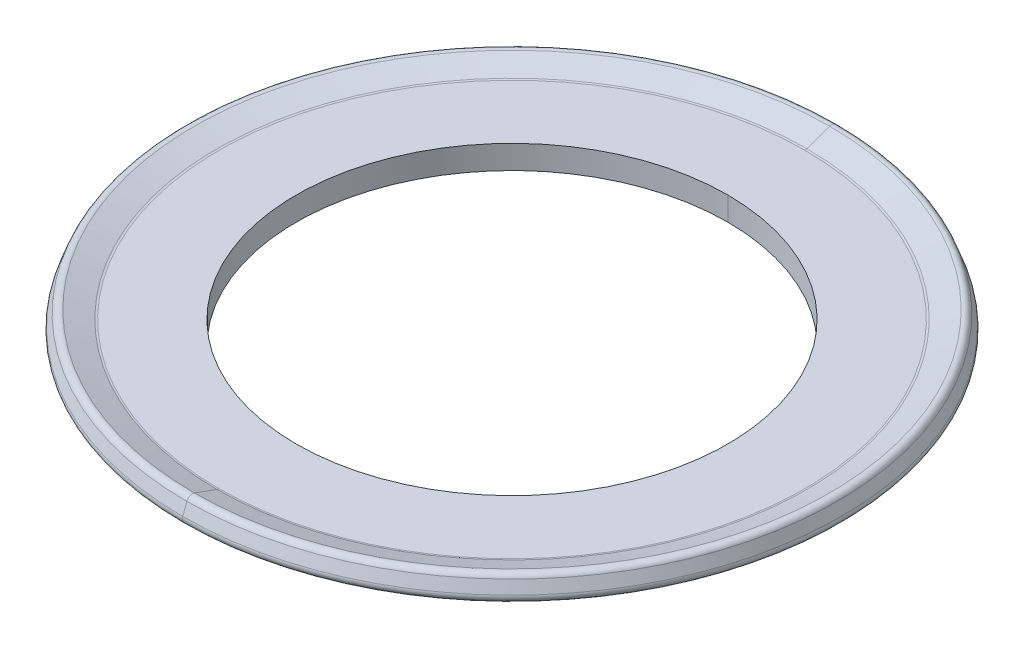
ISO-10303-21;
HEADER;
FILE_DESCRIPTION(('STEP AP214'),'2;1');
FILE_NAME('part.step','',(''),(''),'','','');
FILE_SCHEMA(('AUTOMOTIVE_DESIGN { 1 0 10303 214 1 1 1 1 }'));
ENDSEC;
DATA;
#1=APPLICATION_CONTEXT('core data for automotive mechanical design processes');
#2=APPLICATION_PROTOCOL_DEFINITION('international standard','automotive_design',2000,#1);
#3=PRODUCT_CONTEXT('',#1,'mechanical');
#4=PRODUCT('Part','Part','',(#3));
#5=PRODUCT_RELATED_PRODUCT_CATEGORY('part','',(#4));
#6=PRODUCT_DEFINITION_FORMATION('','',#4);
#7=PRODUCT_DEFINITION_CONTEXT('part definition',#1,'design');
#8=PRODUCT_DEFINITION('design','',#6,#7);
#9=PRODUCT_DEFINITION_SHAPE('','',#8);
#10=(LENGTH_UNIT() NAMED_UNIT(*) SI_UNIT(.MILLI.,.METRE.));
#11=(NAMED_UNIT(*) PLANE_ANGLE_UNIT() SI_UNIT($,.RADIAN.));
#12=(NAMED_UNIT(*) SI_UNIT($,.STERADIAN.) SOLID_ANGLE_UNIT());
#13=UNCERTAINTY_MEASURE_WITH_UNIT(LENGTH_MEASURE(1.E-05),#10,'distance_accuracy_value','');
#14=(GEOMETRIC_REPRESENTATION_CONTEXT(3) GLOBAL_UNCERTAINTY_ASSIGNED_CONTEXT((#13)) GLOBAL_UNIT_ASSIGNED_CONTEXT((#10,
#11,#12)) REPRESENTATION_CONTEXT('',''));
#15=CARTESIAN_POINT('',(0.,0.,0.));
#16=DIRECTION('',(0.,0.,1.));
#17=DIRECTION('',(1.,0.,0.));
#18=AXIS2_PLACEMENT_3D('',#15,#16,#17);
#19=CARTESIAN_POINT('',(0.,0.5,0.));
#20=DIRECTION('',(0.,-1.,0.));
#21=DIRECTION('',(0.,0.,-1.));
#22=AXIS2_PLACEMENT_3D('',#19,#20,#21);
#23=TOROIDAL_SURFACE('',#22,12.5718365096458,0.5);
#24=CARTESIAN_POINT('',(0.,0.5,12.5718365096458));
#25=DIRECTION('',(1.,0.,0.));
#26=DIRECTION('',(0.,0.,-1.));
#27=AXIS2_PLACEMENT_3D('',#24,#25,#26);
#28=CIRCLE('',#27,0.5);
#29=CARTESIAN_POINT('',(0.,0.0301536896070431,12.7428465813086));
#30=VERTEX_POINT('',#29);
#31=CARTESIAN_POINT('',(0.,0.,12.5718365096458));
#32=VERTEX_POINT('',#31);
#33=EDGE_CURVE('E194',#30,#32,#28,.T.);
#34=ORIENTED_EDGE('',*,*,#33,.F.);
#35=CARTESIAN_POINT('',(0.,0.0301536896070431,0.));
#36=DIRECTION('',(0.,1.,0.));
#37=DIRECTION('',(0.,0.,1.));
#38=AXIS2_PLACEMENT_3D('',#35,#36,#37);
#39=CIRCLE('',#38,12.7428465813086);
#40=CARTESIAN_POINT('',(0.,0.0301536896070431,-12.7428465813086));
#41=VERTEX_POINT('',#40);
#42=EDGE_CURVE('E154',#41,#30,#39,.T.);
#43=ORIENTED_EDGE('',*,*,#42,.F.);
#44=CARTESIAN_POINT('',(0.,0.5,-12.5718365096458));
#45=DIRECTION('',(-1.,0.,0.));
#46=DIRECTION('',(0.,0.,1.));
#47=AXIS2_PLACEMENT_3D('',#44,#45,#46);
#48=CIRCLE('',#47,0.5);
#49=CARTESIAN_POINT('',(0.,0.,-12.5718365096458));
#50=VERTEX_POINT('',#49);
#51=EDGE_CURVE('E193',#41,#50,#48,.T.);
#52=ORIENTED_EDGE('',*,*,#51,.T.);
#53=CARTESIAN_POINT('',(0.,0.,0.));
#54=DIRECTION('',(0.,-1.,0.));
#55=DIRECTION('',(0.,0.,-1.));
#56=AXIS2_PLACEMENT_3D('',#53,#54,#55);
#57=CIRCLE('',#56,12.5718365096458);
#58=EDGE_CURVE('E27',#32,#50,#57,.T.);
#59=ORIENTED_EDGE('',*,*,#58,.F.);
#60=EDGE_LOOP('',(#34,#43,#52,#59));
#61=FACE_BOUND('',#60,.T.);
#62=ADVANCED_FACE('F16',(#61),#23,.T.);
#63=CARTESIAN_POINT('',(0.,1.12957180897211,0.));
#64=DIRECTION('',(0.,1.,0.));
#65=DIRECTION('',(0.,0.,1.));
#66=AXIS2_PLACEMENT_3D('',#63,#64,#65);
#67=TOROIDAL_SURFACE('',#66,13.5706197386811,0.25);
#68=CARTESIAN_POINT('',(0.,1.12957180897211,-13.5706197386811));
#69=DIRECTION('',(1.,0.,0.));
#70=DIRECTION('',(0.,0.,-1.));
#71=AXIS2_PLACEMENT_3D('',#68,#69,#70);
#72=CIRCLE('',#71,0.25);
#73=CARTESIAN_POINT('',(0.,1.21507684480352,-13.8055428938775));
#74=VERTEX_POINT('',#73);
#75=CARTESIAN_POINT('',(0.,1.36449496416858,-13.4851147028496));
#76=VERTEX_POINT('',#75);
#77=EDGE_CURVE('E232',#74,#76,#72,.T.);
#78=ORIENTED_EDGE('',*,*,#77,.F.);
#79=CARTESIAN_POINT('',(0.,1.21507684480352,0.));
#80=DIRECTION('',(0.,-1.,0.));
#81=DIRECTION('',(0.,0.,1.));
#82=AXIS2_PLACEMENT_3D('',#79,#80,#81);
#83=CIRCLE('',#82,13.8055428938775);
#84=CARTESIAN_POINT('',(0.,1.21507684480352,13.8055428938775));
#85=VERTEX_POINT('',#84);
#86=EDGE_CURVE('E218',#85,#74,#83,.T.);
#87=ORIENTED_EDGE('',*,*,#86,.F.);
#88=CARTESIAN_POINT('',(0.,1.12957180897211,13.5706197386811));
#89=DIRECTION('',(-1.,0.,0.));
#90=DIRECTION('',(0.,0.,1.));
#91=AXIS2_PLACEMENT_3D('',#88,#89,#90);
#92=CIRCLE('',#91,0.25);
#93=CARTESIAN_POINT('',(0.,1.36449496416858,13.4851147028496));
#94=VERTEX_POINT('',#93);
#95=EDGE_CURVE('E178',#85,#94,#92,.T.);
#96=ORIENTED_EDGE('',*,*,#95,.T.);
#97=CARTESIAN_POINT('',(0.,1.36449496416858,0.));
#98=DIRECTION('',(0.,1.,0.));
#99=DIRECTION('',(0.,0.,-1.));
#100=AXIS2_PLACEMENT_3D('',#97,#98,#99);
#101=CIRCLE('',#100,13.4851147028496);
#102=EDGE_CURVE('E244',#76,#94,#101,.T.);
#103=ORIENTED_EDGE('',*,*,#102,.F.);
#104=EDGE_LOOP('',(#78,#87,#96,#103));
#105=FACE_BOUND('',#104,.T.);
#106=ADVANCED_FACE('F280',(#105),#67,.T.);
#107=CARTESIAN_POINT('',(0.,0.659725498579151,0.));
#108=DIRECTION('',(0.,1.,0.));
#109=DIRECTION('',(0.,0.,1.));
#110=AXIS2_PLACEMENT_3D('',#107,#108,#109);
#111=TOROIDAL_SURFACE('',#110,13.7416298103439,0.25);
#112=CARTESIAN_POINT('',(0.,0.659725498579151,-13.7416298103439));
#113=DIRECTION('',(1.,0.,0.));
#114=DIRECTION('',(0.,0.,-1.));
#115=AXIS2_PLACEMENT_3D('',#112,#113,#114);
#116=CIRCLE('',#115,0.25);
#117=CARTESIAN_POINT('',(0.,0.424802343382673,-13.8271348461753));
#118=VERTEX_POINT('',#117);
#119=CARTESIAN_POINT('',(0.,0.745230534410571,-13.9765529655404));
#120=VERTEX_POINT('',#119);
#121=EDGE_CURVE('E168',#118,#120,#116,.T.);
#122=ORIENTED_EDGE('',*,*,#121,.F.);
#123=CARTESIAN_POINT('',(0.,0.424802343382673,0.));
#124=DIRECTION('',(0.,-1.,0.));
#125=DIRECTION('',(0.,0.,-1.));
#126=AXIS2_PLACEMENT_3D('',#123,#124,#125);
#127=CIRCLE('',#126,13.8271348461753);
#128=CARTESIAN_POINT('',(0.,0.424802343382673,13.8271348461753));
#129=VERTEX_POINT('',#128);
#130=EDGE_CURVE('E145',#129,#118,#127,.T.);
#131=ORIENTED_EDGE('',*,*,#130,.F.);
#132=CARTESIAN_POINT('',(0.,0.659725498579151,13.7416298103439));
#133=DIRECTION('',(-1.,0.,0.));
#134=DIRECTION('',(0.,0.,1.));
#135=AXIS2_PLACEMENT_3D('',#132,#133,#134);
#136=CIRCLE('',#135,0.25);
#137=CARTESIAN_POINT('',(0.,0.745230534410571,13.9765529655404));
#138=VERTEX_POINT('',#137);
#139=EDGE_CURVE('E176',#129,#138,#136,.T.);
#140=ORIENTED_EDGE('',*,*,#139,.T.);
#141=CARTESIAN_POINT('',(0.,0.745230534410571,0.));
#142=DIRECTION('',(0.,1.,0.));
#143=DIRECTION('',(0.,0.,1.));
#144=AXIS2_PLACEMENT_3D('',#141,#142,#143);
#145=CIRCLE('',#144,13.9765529655404);
#146=EDGE_CURVE('E70',#120,#138,#145,.T.);
#147=ORIENTED_EDGE('',*,*,#146,.F.);
#148=EDGE_LOOP('',(#122,#131,#140,#147));
#149=FACE_BOUND('',#148,.T.);
#150=ADVANCED_FACE('F169',(#149),#111,.T.);
#151=CARTESIAN_POINT('',(0.,1.25,0.));
#152=DIRECTION('',(0.,-1.,0.));
#153=DIRECTION('',(0.,0.,-1.));
#154=AXIS2_PLACEMENT_3D('',#151,#152,#153);
#155=TOROIDAL_SURFACE('',#154,12.4395912741144,0.25);
#156=CARTESIAN_POINT('',(0.,1.25,12.4395912741144));
#157=DIRECTION('',(1.,0.,0.));
#158=DIRECTION('',(0.,0.,-1.));
#159=AXIS2_PLACEMENT_3D('',#156,#157,#158);
#160=CIRCLE('',#159,0.25);
#161=CARTESIAN_POINT('',(0.,1.01507684480352,12.5250963099458));
#162=VERTEX_POINT('',#161);
#163=CARTESIAN_POINT('',(0.,1.,12.4395912741144));
#164=VERTEX_POINT('',#163);
#165=EDGE_CURVE('E205',#162,#164,#160,.T.);
#166=ORIENTED_EDGE('',*,*,#165,.F.);
#167=CARTESIAN_POINT('',(0.,1.01507684480352,0.));
#168=DIRECTION('',(0.,-1.,0.));
#169=DIRECTION('',(0.,0.,1.));
#170=AXIS2_PLACEMENT_3D('',#167,#168,#169);
#171=CIRCLE('',#170,12.5250963099458);
#172=CARTESIAN_POINT('',(0.,1.01507684480352,-12.5250963099458));
#173=VERTEX_POINT('',#172);
#174=EDGE_CURVE('E115',#173,#162,#171,.T.);
#175=ORIENTED_EDGE('',*,*,#174,.F.);
#176=CARTESIAN_POINT('',(0.,1.25,-12.4395912741144));
#177=DIRECTION('',(-1.,0.,0.));
#178=DIRECTION('',(0.,0.,1.));
#179=AXIS2_PLACEMENT_3D('',#176,#177,#178);
#180=CIRCLE('',#179,0.25);
#181=CARTESIAN_POINT('',(0.,1.,-12.4395912741144));
#182=VERTEX_POINT('',#181);
#183=EDGE_CURVE('E204',#173,#182,#180,.T.);
#184=ORIENTED_EDGE('',*,*,#183,.T.);
#185=CARTESIAN_POINT('',(0.,1.,0.));
#186=DIRECTION('',(0.,1.,0.));
#187=DIRECTION('',(0.,0.,-1.));
#188=AXIS2_PLACEMENT_3D('',#185,#186,#187);
#189=CIRCLE('',#188,12.4395912741144);
#190=EDGE_CURVE('E20',#164,#182,#189,.T.);
#191=ORIENTED_EDGE('',*,*,#190,.F.);
#192=EDGE_LOOP('',(#166,#175,#184,#191));
#193=FACE_BOUND('',#192,.T.);
#194=ADVANCED_FACE('F309',(#193),#155,.F.);
#195=CARTESIAN_POINT('',(0.,0.,0.));
#196=DIRECTION('',(0.,-1.,0.));
#197=DIRECTION('',(0.,0.,-1.));
#198=AXIS2_PLACEMENT_3D('',#195,#196,#197);
#199=CYLINDRICAL_SURFACE('',#198,9.16);
#200=DIRECTION('',(0.,-1.,0.));
#201=VECTOR('',#200,1.);
#202=CARTESIAN_POINT('',(0.,0.,9.16));
#203=LINE('',#202,#201);
#204=CARTESIAN_POINT('',(0.,1.,9.16));
#205=VERTEX_POINT('',#204);
#206=CARTESIAN_POINT('',(0.,0.,9.16));
#207=VERTEX_POINT('',#206);
#208=EDGE_CURVE('E212',#205,#207,#203,.T.);
#209=ORIENTED_EDGE('',*,*,#208,.F.);
#210=CARTESIAN_POINT('',(0.,1.,0.));
#211=DIRECTION('',(0.,-1.,0.));
#212=DIRECTION('',(0.,0.,-1.));
#213=AXIS2_PLACEMENT_3D('',#210,#211,#212);
#214=CIRCLE('',#213,9.16);
#215=CARTESIAN_POINT('',(0.,1.,-9.16));
#216=VERTEX_POINT('',#215);
#217=EDGE_CURVE('E219',#216,#205,#214,.T.);
#218=ORIENTED_EDGE('',*,*,#217,.F.);
#219=DIRECTION('',(0.,-1.,0.));
#220=VECTOR('',#219,1.);
#221=CARTESIAN_POINT('',(0.,0.,-9.16));
#222=LINE('',#221,#220);
#223=CARTESIAN_POINT('',(0.,0.,-9.16));
#224=VERTEX_POINT('',#223);
#225=EDGE_CURVE('E165',#216,#224,#222,.T.);
#226=ORIENTED_EDGE('',*,*,#225,.T.);
#227=CARTESIAN_POINT('',(0.,0.,0.));
#228=DIRECTION('',(0.,-1.,0.));
#229=DIRECTION('',(0.,0.,-1.));
#230=AXIS2_PLACEMENT_3D('',#227,#228,#229);
#231=CIRCLE('',#230,9.16);
#232=EDGE_CURVE('E10',#224,#207,#231,.T.);
#233=ORIENTED_EDGE('',*,*,#232,.T.);
#234=EDGE_LOOP('',(#209,#218,#226,#233));
#235=FACE_BOUND('',#234,.T.);
#236=ADVANCED_FACE('F319',(#235),#199,.F.);
#237=CARTESIAN_POINT('',(0.,0.,0.));
#238=DIRECTION('',(0.,-1.,0.));
#239=DIRECTION('',(0.,0.,-1.));
#240=AXIS2_PLACEMENT_3D('',#237,#238,#239);
#241=PLANE('',#240);
#242=ORIENTED_EDGE('',*,*,#232,.F.);
#243=CARTESIAN_POINT('',(0.,0.,0.));
#244=DIRECTION('',(0.,-1.,0.));
#245=DIRECTION('',(0.,0.,-1.));
#246=AXIS2_PLACEMENT_3D('',#243,#244,#245);
#247=CIRCLE('',#246,9.16);
#248=EDGE_CURVE('E253',#207,#224,#247,.T.);
#249=ORIENTED_EDGE('',*,*,#248,.F.);
#250=EDGE_LOOP('',(#242,#249));
#251=FACE_BOUND('',#250,.T.);
#252=CARTESIAN_POINT('',(0.,0.,0.));
#253=DIRECTION('',(0.,-1.,0.));
#254=DIRECTION('',(0.,0.,-1.));
#255=AXIS2_PLACEMENT_3D('',#252,#253,#254);
#256=CIRCLE('',#255,12.5718365096458);
#257=EDGE_CURVE('E191',#50,#32,#256,.T.);
#258=ORIENTED_EDGE('',*,*,#257,.T.);
#259=ORIENTED_EDGE('',*,*,#58,.T.);
#260=EDGE_LOOP('',(#258,#259));
#261=FACE_BOUND('',#260,.T.);
#262=ADVANCED_FACE('F311',(#251,#261),#241,.T.);
#263=CARTESIAN_POINT('',(0.,0.510307379214091,0.));
#264=DIRECTION('',(0.,1.,0.));
#265=DIRECTION('',(0.,0.,1.));
#266=AXIS2_PLACEMENT_3D('',#263,#264,#265);
#267=CONICAL_SURFACE('',#266,14.0620580013718,1.22173047639603);
#268=DIRECTION('',(0.,0.342020143325669,-0.939692620785908));
#269=VECTOR('',#268,1.);
#270=CARTESIAN_POINT('',(0.,0.510307379214091,-14.0620580013718));
#271=LINE('',#270,#269);
#272=EDGE_CURVE('E148',#41,#118,#271,.T.);
#273=ORIENTED_EDGE('',*,*,#272,.F.);
#274=ORIENTED_EDGE('',*,*,#42,.T.);
#275=DIRECTION('',(0.,0.342020143325669,0.939692620785908));
#276=VECTOR('',#275,1.);
#277=CARTESIAN_POINT('',(0.,0.510307379214091,14.0620580013718));
#278=LINE('',#277,#276);
#279=EDGE_CURVE('E151',#30,#129,#278,.T.);
#280=ORIENTED_EDGE('',*,*,#279,.T.);
#281=ORIENTED_EDGE('',*,*,#130,.T.);
#282=EDGE_LOOP('',(#273,#274,#280,#281));
#283=FACE_BOUND('',#282,.T.);
#284=ADVANCED_FACE('F147',(#283),#267,.T.);
#285=CARTESIAN_POINT('',(0.,1.45,0.));
#286=DIRECTION('',(0.,-1.,0.));
#287=DIRECTION('',(0.,0.,-1.));
#288=AXIS2_PLACEMENT_3D('',#285,#286,#287);
#289=CONICAL_SURFACE('',#288,13.7200378580461,0.349065850398866);
#290=DIRECTION('',(0.,-0.939692620785908,0.342020143325669));
#291=VECTOR('',#290,1.);
#292=CARTESIAN_POINT('',(0.,1.45,13.7200378580461));
#293=LINE('',#292,#291);
#294=EDGE_CURVE('E215',#85,#138,#293,.T.);
#295=ORIENTED_EDGE('',*,*,#294,.F.);
#296=ORIENTED_EDGE('',*,*,#86,.T.);
#297=DIRECTION('',(0.,-0.939692620785908,-0.342020143325669));
#298=VECTOR('',#297,1.);
#299=CARTESIAN_POINT('',(0.,1.45,-13.7200378580461));
#300=LINE('',#299,#298);
#301=EDGE_CURVE('E224',#74,#120,#300,.T.);
#302=ORIENTED_EDGE('',*,*,#301,.T.);
#303=ORIENTED_EDGE('',*,*,#146,.T.);
#304=EDGE_LOOP('',(#295,#296,#302,#303));
#305=FACE_BOUND('',#304,.T.);
#306=ADVANCED_FACE('F274',(#305),#289,.T.);
#307=CARTESIAN_POINT('',(0.,1.,0.));
#308=DIRECTION('',(0.,1.,0.));
#309=DIRECTION('',(0.,0.,1.));
#310=AXIS2_PLACEMENT_3D('',#307,#308,#309);
#311=CONICAL_SURFACE('',#310,12.4836730192915,1.22173047639603);
#312=DIRECTION('',(0.,0.34202014332567,-0.939692620785908));
#313=VECTOR('',#312,1.);
#314=CARTESIAN_POINT('',(0.,1.,-12.4836730192915));
#315=LINE('',#314,#313);
#316=EDGE_CURVE('E227',#173,#76,#315,.T.);
#317=ORIENTED_EDGE('',*,*,#316,.F.);
#318=ORIENTED_EDGE('',*,*,#174,.T.);
#319=DIRECTION('',(0.,0.34202014332567,0.939692620785908));
#320=VECTOR('',#319,1.);
#321=CARTESIAN_POINT('',(0.,1.,12.4836730192915));
#322=LINE('',#321,#320);
#323=EDGE_CURVE('E136',#162,#94,#322,.T.);
#324=ORIENTED_EDGE('',*,*,#323,.T.);
#325=CARTESIAN_POINT('',(0.,1.36449496416858,0.));
#326=DIRECTION('',(0.,1.,0.));
#327=DIRECTION('',(0.,0.,-1.));
#328=AXIS2_PLACEMENT_3D('',#325,#326,#327);
#329=CIRCLE('',#328,13.4851147028496);
#330=EDGE_CURVE('E186',#94,#76,#329,.T.);
#331=ORIENTED_EDGE('',*,*,#330,.T.);
#332=EDGE_LOOP('',(#317,#318,#324,#331));
#333=FACE_BOUND('',#332,.T.);
#334=ADVANCED_FACE('F285',(#333),#311,.F.);
#335=CARTESIAN_POINT('',(0.,1.,0.));
#336=DIRECTION('',(0.,-1.,0.));
#337=DIRECTION('',(0.,0.,-1.));
#338=AXIS2_PLACEMENT_3D('',#335,#336,#337);
#339=PLANE('',#338);
#340=ORIENTED_EDGE('',*,*,#217,.T.);
#341=CARTESIAN_POINT('',(0.,1.,0.));
#342=DIRECTION('',(0.,-1.,0.));
#343=DIRECTION('',(0.,0.,-1.));
#344=AXIS2_PLACEMENT_3D('',#341,#342,#343);
#345=CIRCLE('',#344,9.16);
#346=EDGE_CURVE('E208',#205,#216,#345,.T.);
#347=ORIENTED_EDGE('',*,*,#346,.T.);
#348=EDGE_LOOP('',(#340,#347));
#349=FACE_BOUND('',#348,.T.);
#350=CARTESIAN_POINT('',(0.,1.,0.));
#351=DIRECTION('',(0.,1.,0.));
#352=DIRECTION('',(0.,0.,-1.));
#353=AXIS2_PLACEMENT_3D('',#350,#351,#352);
#354=CIRCLE('',#353,12.4395912741144);
#355=EDGE_CURVE('E201',#182,#164,#354,.T.);
#356=ORIENTED_EDGE('',*,*,#355,.T.);
#357=ORIENTED_EDGE('',*,*,#190,.T.);
#358=EDGE_LOOP('',(#356,#357));
#359=FACE_BOUND('',#358,.T.);
#360=ADVANCED_FACE('F287',(#349,#359),#339,.F.);
#361=CARTESIAN_POINT('',(0.,1.,0.));
#362=DIRECTION('',(0.,1.,0.));
#363=DIRECTION('',(0.,0.,1.));
#364=AXIS2_PLACEMENT_3D('',#361,#362,#363);
#365=CONICAL_SURFACE('',#364,12.4836730192915,1.22173047639603);
#366=CARTESIAN_POINT('',(0.,1.01507684480352,0.));
#367=DIRECTION('',(0.,-1.,0.));
#368=DIRECTION('',(0.,0.,1.));
#369=AXIS2_PLACEMENT_3D('',#366,#367,#368);
#370=CIRCLE('',#369,12.5250963099458);
#371=EDGE_CURVE('E220',#162,#173,#370,.T.);
#372=ORIENTED_EDGE('',*,*,#371,.T.);
#373=ORIENTED_EDGE('',*,*,#316,.T.);
#374=ORIENTED_EDGE('',*,*,#102,.T.);
#375=ORIENTED_EDGE('',*,*,#323,.F.);
#376=EDGE_LOOP('',(#372,#373,#374,#375));
#377=FACE_BOUND('',#376,.T.);
#378=ADVANCED_FACE('F282',(#377),#365,.F.);
#379=CARTESIAN_POINT('',(0.,1.45,0.));
#380=DIRECTION('',(0.,-1.,0.));
#381=DIRECTION('',(0.,0.,-1.));
#382=AXIS2_PLACEMENT_3D('',#379,#380,#381);
#383=CONICAL_SURFACE('',#382,13.7200378580461,0.349065850398866);
#384=CARTESIAN_POINT('',(0.,1.21507684480352,0.));
#385=DIRECTION('',(0.,-1.,0.));
#386=DIRECTION('',(0.,0.,1.));
#387=AXIS2_PLACEMENT_3D('',#384,#385,#386);
#388=CIRCLE('',#387,13.8055428938775);
#389=EDGE_CURVE('E241',#74,#85,#388,.T.);
#390=ORIENTED_EDGE('',*,*,#389,.T.);
#391=ORIENTED_EDGE('',*,*,#294,.T.);
#392=CARTESIAN_POINT('',(0.,0.745230534410571,0.));
#393=DIRECTION('',(0.,1.,0.));
#394=DIRECTION('',(0.,0.,1.));
#395=AXIS2_PLACEMENT_3D('',#392,#393,#394);
#396=CIRCLE('',#395,13.9765529655404);
#397=EDGE_CURVE('E173',#138,#120,#396,.T.);
#398=ORIENTED_EDGE('',*,*,#397,.T.);
#399=ORIENTED_EDGE('',*,*,#301,.F.);
#400=EDGE_LOOP('',(#390,#391,#398,#399));
#401=FACE_BOUND('',#400,.T.);
#402=ADVANCED_FACE('F270',(#401),#383,.T.);
#403=CARTESIAN_POINT('',(0.,0.510307379214091,0.));
#404=DIRECTION('',(0.,1.,0.));
#405=DIRECTION('',(0.,0.,1.));
#406=AXIS2_PLACEMENT_3D('',#403,#404,#405);
#407=CONICAL_SURFACE('',#406,14.0620580013718,1.22173047639603);
#408=CARTESIAN_POINT('',(0.,0.0301536896070431,0.));
#409=DIRECTION('',(0.,1.,0.));
#410=DIRECTION('',(0.,0.,1.));
#411=AXIS2_PLACEMENT_3D('',#408,#409,#410);
#412=CIRCLE('',#411,12.7428465813086);
#413=EDGE_CURVE('E163',#30,#41,#412,.T.);
#414=ORIENTED_EDGE('',*,*,#413,.T.);
#415=ORIENTED_EDGE('',*,*,#272,.T.);
#416=CARTESIAN_POINT('',(0.,0.424802343382673,0.));
#417=DIRECTION('',(0.,-1.,0.));
#418=DIRECTION('',(0.,0.,-1.));
#419=AXIS2_PLACEMENT_3D('',#416,#417,#418);
#420=CIRCLE('',#419,13.8271348461753);
#421=EDGE_CURVE('E161',#118,#129,#420,.T.);
#422=ORIENTED_EDGE('',*,*,#421,.T.);
#423=ORIENTED_EDGE('',*,*,#279,.F.);
#424=EDGE_LOOP('',(#414,#415,#422,#423));
#425=FACE_BOUND('',#424,.T.);
#426=ADVANCED_FACE('F159',(#425),#407,.T.);
#427=CARTESIAN_POINT('',(0.,0.,0.));
#428=DIRECTION('',(0.,-1.,0.));
#429=DIRECTION('',(0.,0.,-1.));
#430=AXIS2_PLACEMENT_3D('',#427,#428,#429);
#431=CYLINDRICAL_SURFACE('',#430,9.16);
#432=ORIENTED_EDGE('',*,*,#346,.F.);
#433=ORIENTED_EDGE('',*,*,#208,.T.);
#434=ORIENTED_EDGE('',*,*,#248,.T.);
#435=ORIENTED_EDGE('',*,*,#225,.F.);
#436=EDGE_LOOP('',(#432,#433,#434,#435));
#437=FACE_BOUND('',#436,.T.);
#438=ADVANCED_FACE('F18',(#437),#431,.F.);
#439=CARTESIAN_POINT('',(0.,1.25,0.));
#440=DIRECTION('',(0.,-1.,0.));
#441=DIRECTION('',(0.,0.,-1.));
#442=AXIS2_PLACEMENT_3D('',#439,#440,#441);
#443=TOROIDAL_SURFACE('',#442,12.4395912741144,0.25);
#444=ORIENTED_EDGE('',*,*,#371,.F.);
#445=ORIENTED_EDGE('',*,*,#165,.T.);
#446=ORIENTED_EDGE('',*,*,#355,.F.);
#447=ORIENTED_EDGE('',*,*,#183,.F.);
#448=EDGE_LOOP('',(#444,#445,#446,#447));
#449=FACE_BOUND('',#448,.T.);
#450=ADVANCED_FACE('F325',(#449),#443,.F.);
#451=CARTESIAN_POINT('',(0.,0.659725498579151,0.));
#452=DIRECTION('',(0.,1.,0.));
#453=DIRECTION('',(0.,0.,1.));
#454=AXIS2_PLACEMENT_3D('',#451,#452,#453);
#455=TOROIDAL_SURFACE('',#454,13.7416298103439,0.25);
#456=ORIENTED_EDGE('',*,*,#421,.F.);
#457=ORIENTED_EDGE('',*,*,#121,.T.);
#458=ORIENTED_EDGE('',*,*,#397,.F.);
#459=ORIENTED_EDGE('',*,*,#139,.F.);
#460=EDGE_LOOP('',(#456,#457,#458,#459));
#461=FACE_BOUND('',#460,.T.);
#462=ADVANCED_FACE('F175',(#461),#455,.T.);
#463=CARTESIAN_POINT('',(0.,1.12957180897211,0.));
#464=DIRECTION('',(0.,1.,0.));
#465=DIRECTION('',(0.,0.,1.));
#466=AXIS2_PLACEMENT_3D('',#463,#464,#465);
#467=TOROIDAL_SURFACE('',#466,13.5706197386811,0.25);
#468=ORIENTED_EDGE('',*,*,#389,.F.);
#469=ORIENTED_EDGE('',*,*,#77,.T.);
#470=ORIENTED_EDGE('',*,*,#330,.F.);
#471=ORIENTED_EDGE('',*,*,#95,.F.);
#472=EDGE_LOOP('',(#468,#469,#470,#471));
#473=FACE_BOUND('',#472,.T.);
#474=ADVANCED_FACE('F277',(#473),#467,.T.);
#475=CARTESIAN_POINT('',(0.,0.5,0.));
#476=DIRECTION('',(0.,-1.,0.));
#477=DIRECTION('',(0.,0.,-1.));
#478=AXIS2_PLACEMENT_3D('',#475,#476,#477);
#479=TOROIDAL_SURFACE('',#478,12.5718365096458,0.5);
#480=ORIENTED_EDGE('',*,*,#413,.F.);
#481=ORIENTED_EDGE('',*,*,#33,.T.);
#482=ORIENTED_EDGE('',*,*,#257,.F.);
#483=ORIENTED_EDGE('',*,*,#51,.F.);
#484=EDGE_LOOP('',(#480,#481,#482,#483));
#485=FACE_BOUND('',#484,.T.);
#486=ADVANCED_FACE('F315',(#485),#479,.T.);
#487=CLOSED_SHELL('',(#62,#106,#150,#194,#236,#262,#284,#306,#334,#360,#378,#402,#426,#438,#450,
#462,#474,#486));
#488=MANIFOLD_SOLID_BREP('B1',#487);
#489=ADVANCED_BREP_SHAPE_REPRESENTATION('',(#18,#488),#14);
#490=SHAPE_DEFINITION_REPRESENTATION(#9,#489);
ENDSEC;
END-ISO-10303-21;
